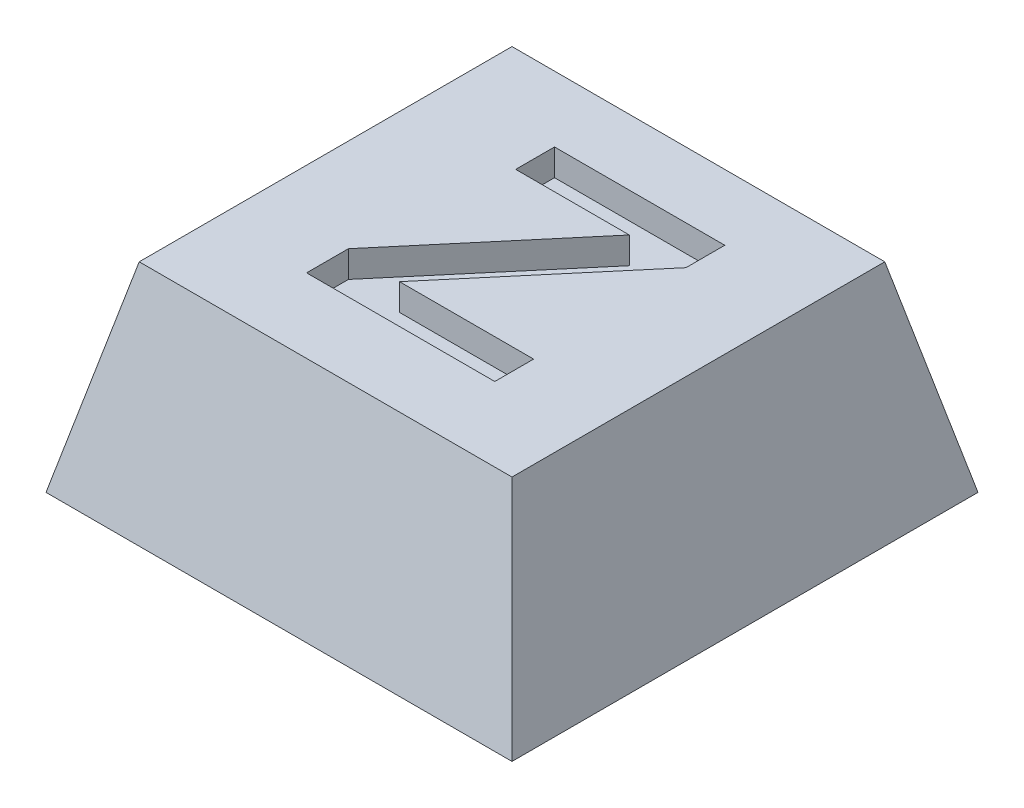
ISO-10303-21;
HEADER;
FILE_DESCRIPTION(('STEP AP214'),'2;1');
FILE_NAME('part.step','',(''),(''),'','','');
FILE_SCHEMA(('AUTOMOTIVE_DESIGN { 1 0 10303 214 1 1 1 1 }'));
ENDSEC;
DATA;
#1=APPLICATION_CONTEXT('core data for automotive mechanical design processes');
#2=APPLICATION_PROTOCOL_DEFINITION('international standard','automotive_design',2000,#1);
#3=PRODUCT_CONTEXT('',#1,'mechanical');
#4=PRODUCT('Part','Part','',(#3));
#5=PRODUCT_RELATED_PRODUCT_CATEGORY('part','',(#4));
#6=PRODUCT_DEFINITION_FORMATION('','',#4);
#7=PRODUCT_DEFINITION_CONTEXT('part definition',#1,'design');
#8=PRODUCT_DEFINITION('design','',#6,#7);
#9=PRODUCT_DEFINITION_SHAPE('','',#8);
#10=(LENGTH_UNIT() NAMED_UNIT(*) SI_UNIT(.MILLI.,.METRE.));
#11=(NAMED_UNIT(*) PLANE_ANGLE_UNIT() SI_UNIT($,.RADIAN.));
#12=(NAMED_UNIT(*) SI_UNIT($,.STERADIAN.) SOLID_ANGLE_UNIT());
#13=UNCERTAINTY_MEASURE_WITH_UNIT(LENGTH_MEASURE(1.E-05),#10,'distance_accuracy_value','');
#14=(GEOMETRIC_REPRESENTATION_CONTEXT(3) GLOBAL_UNCERTAINTY_ASSIGNED_CONTEXT((#13)) GLOBAL_UNIT_ASSIGNED_CONTEXT((#10,
#11,#12)) REPRESENTATION_CONTEXT('',''));
#15=CARTESIAN_POINT('',(0.,0.,0.));
#16=DIRECTION('',(0.,0.,1.));
#17=DIRECTION('',(1.,0.,0.));
#18=AXIS2_PLACEMENT_3D('',#15,#16,#17);
#19=CARTESIAN_POINT('',(0.,3.,0.));
#20=DIRECTION('',(0.,-1.,0.));
#21=DIRECTION('',(0.,0.,-1.));
#22=AXIS2_PLACEMENT_3D('',#19,#20,#21);
#23=PLANE('',#22);
#24=DIRECTION('',(-1.,0.,0.));
#25=VECTOR('',#24,1.);
#26=CARTESIAN_POINT('',(11.,3.,-0.7));
#27=LINE('',#26,#25);
#28=CARTESIAN_POINT('',(6.3,3.,-0.7));
#29=VERTEX_POINT('',#28);
#30=CARTESIAN_POINT('',(0.7,3.,-0.7));
#31=VERTEX_POINT('',#30);
#32=EDGE_CURVE('E65',#29,#31,#27,.T.);
#33=ORIENTED_EDGE('',*,*,#32,.F.);
#34=DIRECTION('',(0.,0.,1.));
#35=VECTOR('',#34,1.);
#36=CARTESIAN_POINT('',(6.3,3.,-7.));
#37=LINE('',#36,#35);
#38=CARTESIAN_POINT('',(6.3,3.,-6.3));
#39=VERTEX_POINT('',#38);
#40=EDGE_CURVE('E194',#39,#29,#37,.T.);
#41=ORIENTED_EDGE('',*,*,#40,.F.);
#42=DIRECTION('',(-1.,0.,0.));
#43=VECTOR('',#42,1.);
#44=CARTESIAN_POINT('',(11.,3.,-6.3));
#45=LINE('',#44,#43);
#46=CARTESIAN_POINT('',(0.699999999999998,3.,-6.3));
#47=VERTEX_POINT('',#46);
#48=EDGE_CURVE('E181',#39,#47,#45,.T.);
#49=ORIENTED_EDGE('',*,*,#48,.T.);
#50=DIRECTION('',(0.,0.,1.));
#51=VECTOR('',#50,1.);
#52=CARTESIAN_POINT('',(0.7,3.,-7.));
#53=LINE('',#52,#51);
#54=EDGE_CURVE('E195',#47,#31,#53,.T.);
#55=ORIENTED_EDGE('',*,*,#54,.T.);
#56=EDGE_LOOP('',(#33,#41,#49,#55));
#57=FACE_BOUND('',#56,.T.);
#58=DIRECTION('',(-1.,0.,0.));
#59=VECTOR('',#58,1.);
#60=CARTESIAN_POINT('',(4.92794379905714,3.,-1.81325809259612));
#61=LINE('',#60,#59);
#62=CARTESIAN_POINT('',(4.92794379905714,3.,-1.81325809259612));
#63=VERTEX_POINT('',#62);
#64=CARTESIAN_POINT('',(2.10102072213406,3.,-1.81325809259612));
#65=VERTEX_POINT('',#64);
#66=EDGE_CURVE('E58',#63,#65,#61,.T.);
#67=ORIENTED_EDGE('',*,*,#66,.T.);
#68=DIRECTION('',(0.,0.,-1.));
#69=VECTOR('',#68,1.);
#70=CARTESIAN_POINT('',(2.10102072213406,3.,-1.81325809259612));
#71=LINE('',#70,#69);
#72=CARTESIAN_POINT('',(2.10102072213406,3.,-2.44146322080125));
#73=VERTEX_POINT('',#72);
#74=EDGE_CURVE('E165',#65,#73,#71,.T.);
#75=ORIENTED_EDGE('',*,*,#74,.T.);
#76=DIRECTION('',(0.644870939209783,0.,-0.764291483507891));
#77=VECTOR('',#76,1.);
#78=CARTESIAN_POINT('',(2.10102072213406,3.,-2.44146322080125));
#79=LINE('',#78,#77);
#80=CARTESIAN_POINT('',(4.03191014521099,3.,-4.72992475926278));
#81=VERTEX_POINT('',#80);
#82=EDGE_CURVE('E490',#73,#81,#79,.T.);
#83=ORIENTED_EDGE('',*,*,#82,.T.);
#84=DIRECTION('',(-1.,0.,0.));
#85=VECTOR('',#84,1.);
#86=CARTESIAN_POINT('',(4.03191014521099,3.,-4.72992475926278));
#87=LINE('',#86,#85);
#88=CARTESIAN_POINT('',(2.32537969649304,3.,-4.72992475926278));
#89=VERTEX_POINT('',#88);
#90=EDGE_CURVE('E492',#81,#89,#87,.T.);
#91=ORIENTED_EDGE('',*,*,#90,.T.);
#92=DIRECTION('',(0.,0.,-1.));
#93=VECTOR('',#92,1.);
#94=CARTESIAN_POINT('',(2.32537969649304,3.,-4.72992475926278));
#95=LINE('',#94,#93);
#96=CARTESIAN_POINT('',(2.32537969649304,3.,-5.31325809259612));
#97=VERTEX_POINT('',#96);
#98=EDGE_CURVE('E497',#89,#97,#95,.T.);
#99=ORIENTED_EDGE('',*,*,#98,.T.);
#100=DIRECTION('',(1.,0.,0.));
#101=VECTOR('',#100,1.);
#102=CARTESIAN_POINT('',(2.32537969649304,3.,-5.31325809259612));
#103=LINE('',#102,#101);
#104=CARTESIAN_POINT('',(4.88307200418534,3.,-5.31325809259612));
#105=VERTEX_POINT('',#104);
#106=EDGE_CURVE('E507',#97,#105,#103,.T.);
#107=ORIENTED_EDGE('',*,*,#106,.T.);
#108=DIRECTION('',(0.,0.,1.));
#109=VECTOR('',#108,1.);
#110=CARTESIAN_POINT('',(4.88307200418534,3.,-5.31325809259612));
#111=LINE('',#110,#109);
#112=CARTESIAN_POINT('',(4.88307200418534,3.,-4.72992475926278));
#113=VERTEX_POINT('',#112);
#114=EDGE_CURVE('E462',#105,#113,#111,.T.);
#115=ORIENTED_EDGE('',*,*,#114,.T.);
#116=DIRECTION('',(-0.645005060359543,0.,0.76417829863886));
#117=VECTOR('',#116,1.);
#118=CARTESIAN_POINT('',(4.88307200418534,3.,-4.72992475926278));
#119=LINE('',#118,#117);
#120=CARTESIAN_POINT('',(2.91362088239047,3.,-2.39659142592945));
#121=VERTEX_POINT('',#120);
#122=EDGE_CURVE('E457',#113,#121,#119,.T.);
#123=ORIENTED_EDGE('',*,*,#122,.T.);
#124=DIRECTION('',(1.,0.,0.));
#125=VECTOR('',#124,1.);
#126=CARTESIAN_POINT('',(2.91362088239047,3.,-2.39659142592945));
#127=LINE('',#126,#125);
#128=CARTESIAN_POINT('',(4.92794379905714,3.,-2.39659142592945));
#129=VERTEX_POINT('',#128);
#130=EDGE_CURVE('E451',#121,#129,#127,.T.);
#131=ORIENTED_EDGE('',*,*,#130,.T.);
#132=DIRECTION('',(0.,0.,1.));
#133=VECTOR('',#132,1.);
#134=CARTESIAN_POINT('',(4.92794379905714,3.,-2.39659142592945));
#135=LINE('',#134,#133);
#136=EDGE_CURVE('E161',#129,#63,#135,.T.);
#137=ORIENTED_EDGE('',*,*,#136,.T.);
#138=EDGE_LOOP('',(#67,#75,#83,#91,#99,#107,#115,#123,#131,#137));
#139=FACE_BOUND('',#138,.T.);
#140=ADVANCED_FACE('F42',(#57,#139),#23,.F.);
#141=CARTESIAN_POINT('',(7.,0.,-7.));
#142=DIRECTION('',(-0.973841209741793,-0.227229615606418,0.));
#143=DIRECTION('',(0.227229615606418,-0.973841209741793,0.));
#144=AXIS2_PLACEMENT_3D('',#141,#142,#143);
#145=PLANE('',#144);
#146=DIRECTION('',(-0.221581128241521,0.949633406749377,-0.221581128241521));
#147=VECTOR('',#146,1.);
#148=CARTESIAN_POINT('',(6.6563126252505,1.47294589178357,-0.343687374749499));
#149=LINE('',#148,#147);
#150=CARTESIAN_POINT('',(7.,0.,0.));
#151=VERTEX_POINT('',#150);
#152=EDGE_CURVE('E191',#151,#29,#149,.T.);
#153=ORIENTED_EDGE('',*,*,#152,.F.);
#154=DIRECTION('',(0.,0.,-1.));
#155=VECTOR('',#154,1.);
#156=CARTESIAN_POINT('',(7.,0.,0.));
#157=LINE('',#156,#155);
#158=CARTESIAN_POINT('',(7.,0.,-7.));
#159=VERTEX_POINT('',#158);
#160=EDGE_CURVE('E209',#151,#159,#157,.T.);
#161=ORIENTED_EDGE('',*,*,#160,.T.);
#162=DIRECTION('',(0.221581128241521,-0.949633406749377,-0.221581128241521));
#163=VECTOR('',#162,1.);
#164=CARTESIAN_POINT('',(7.,0.,-7.));
#165=LINE('',#164,#163);
#166=EDGE_CURVE('E185',#39,#159,#165,.T.);
#167=ORIENTED_EDGE('',*,*,#166,.F.);
#168=ORIENTED_EDGE('',*,*,#40,.T.);
#169=EDGE_LOOP('',(#153,#161,#167,#168));
#170=FACE_BOUND('',#169,.T.);
#171=ADVANCED_FACE('F234',(#170),#145,.F.);
#172=CARTESIAN_POINT('',(0.,0.,-7.));
#173=DIRECTION('',(0.973841209741793,-0.227229615606418,0.));
#174=DIRECTION('',(0.227229615606418,0.973841209741793,0.));
#175=AXIS2_PLACEMENT_3D('',#172,#173,#174);
#176=PLANE('',#175);
#177=DIRECTION('',(-0.221581128241521,-0.949633406749378,0.221581128241521));
#178=VECTOR('',#177,1.);
#179=CARTESIAN_POINT('',(0.343687374749499,1.47294589178357,-0.3436873747495));
#180=LINE('',#179,#178);
#181=CARTESIAN_POINT('',(0.,0.,0.));
#182=VERTEX_POINT('',#181);
#183=EDGE_CURVE('E11',#31,#182,#180,.T.);
#184=ORIENTED_EDGE('',*,*,#183,.F.);
#185=ORIENTED_EDGE('',*,*,#54,.F.);
#186=DIRECTION('',(0.221581128241521,0.949633406749377,0.221581128241521));
#187=VECTOR('',#186,1.);
#188=CARTESIAN_POINT('',(0.,0.,-7.));
#189=LINE('',#188,#187);
#190=CARTESIAN_POINT('',(0.,0.,-7.));
#191=VERTEX_POINT('',#190);
#192=EDGE_CURVE('E51',#191,#47,#189,.T.);
#193=ORIENTED_EDGE('',*,*,#192,.F.);
#194=DIRECTION('',(0.,0.,1.));
#195=VECTOR('',#194,1.);
#196=CARTESIAN_POINT('',(0.,0.,0.));
#197=LINE('',#196,#195);
#198=EDGE_CURVE('E199',#191,#182,#197,.T.);
#199=ORIENTED_EDGE('',*,*,#198,.T.);
#200=EDGE_LOOP('',(#184,#185,#193,#199));
#201=FACE_BOUND('',#200,.T.);
#202=ADVANCED_FACE('F227',(#201),#176,.F.);
#203=CARTESIAN_POINT('',(0.,0.,0.));
#204=DIRECTION('',(0.,-1.,0.));
#205=DIRECTION('',(0.,0.,-1.));
#206=AXIS2_PLACEMENT_3D('',#203,#204,#205);
#207=PLANE('',#206);
#208=CARTESIAN_POINT('',(3.5,0.,-3.5));
#209=DIRECTION('',(0.,-1.,0.));
#210=DIRECTION('',(0.,0.,-1.));
#211=AXIS2_PLACEMENT_3D('',#208,#209,#210);
#212=CIRCLE('',#211,1.8);
#213=CARTESIAN_POINT('',(3.5,0.,-5.3));
#214=VERTEX_POINT('',#213);
#215=EDGE_CURVE('E167',#214,#214,#212,.T.);
#216=ORIENTED_EDGE('',*,*,#215,.F.);
#217=EDGE_LOOP('',(#216));
#218=FACE_BOUND('',#217,.T.);
#219=ORIENTED_EDGE('',*,*,#198,.F.);
#220=DIRECTION('',(-1.,0.,0.));
#221=VECTOR('',#220,1.);
#222=CARTESIAN_POINT('',(0.,0.,-7.));
#223=LINE('',#222,#221);
#224=EDGE_CURVE('E213',#159,#191,#223,.T.);
#225=ORIENTED_EDGE('',*,*,#224,.F.);
#226=ORIENTED_EDGE('',*,*,#160,.F.);
#227=DIRECTION('',(1.,0.,0.));
#228=VECTOR('',#227,1.);
#229=CARTESIAN_POINT('',(0.,0.,0.));
#230=LINE('',#229,#228);
#231=EDGE_CURVE('E206',#182,#151,#230,.T.);
#232=ORIENTED_EDGE('',*,*,#231,.F.);
#233=EDGE_LOOP('',(#219,#225,#226,#232));
#234=FACE_BOUND('',#233,.T.);
#235=ADVANCED_FACE('F44',(#218,#234),#207,.T.);
#236=CARTESIAN_POINT('',(11.,3.,-6.3));
#237=DIRECTION('',(0.,0.227229615606418,-0.973841209741793));
#238=DIRECTION('',(0.,0.973841209741793,0.227229615606418));
#239=AXIS2_PLACEMENT_3D('',#236,#237,#238);
#240=PLANE('',#239);
#241=ORIENTED_EDGE('',*,*,#166,.T.);
#242=ORIENTED_EDGE('',*,*,#224,.T.);
#243=ORIENTED_EDGE('',*,*,#192,.T.);
#244=ORIENTED_EDGE('',*,*,#48,.F.);
#245=EDGE_LOOP('',(#241,#242,#243,#244));
#246=FACE_BOUND('',#245,.T.);
#247=ADVANCED_FACE('F218',(#246),#240,.T.);
#248=CARTESIAN_POINT('',(11.,0.,0.));
#249=DIRECTION('',(0.,0.227229615606418,0.973841209741793));
#250=DIRECTION('',(0.,-0.973841209741793,0.227229615606418));
#251=AXIS2_PLACEMENT_3D('',#248,#249,#250);
#252=PLANE('',#251);
#253=ORIENTED_EDGE('',*,*,#152,.T.);
#254=ORIENTED_EDGE('',*,*,#32,.T.);
#255=ORIENTED_EDGE('',*,*,#183,.T.);
#256=ORIENTED_EDGE('',*,*,#231,.T.);
#257=EDGE_LOOP('',(#253,#254,#255,#256));
#258=FACE_BOUND('',#257,.T.);
#259=ADVANCED_FACE('F229',(#258),#252,.T.);
#260=CARTESIAN_POINT('',(3.5,0.8,-3.5));
#261=DIRECTION('',(0.,-1.,0.));
#262=DIRECTION('',(0.,0.,-1.));
#263=AXIS2_PLACEMENT_3D('',#260,#261,#262);
#264=CYLINDRICAL_SURFACE('',#263,1.8);
#265=CARTESIAN_POINT('',(3.5,0.8,-3.5));
#266=DIRECTION('',(0.,-1.,0.));
#267=DIRECTION('',(0.,0.,-1.));
#268=AXIS2_PLACEMENT_3D('',#265,#266,#267);
#269=CIRCLE('',#268,1.8);
#270=CARTESIAN_POINT('',(3.5,0.8,-5.3));
#271=VERTEX_POINT('',#270);
#272=EDGE_CURVE('E173',#271,#271,#269,.T.);
#273=ORIENTED_EDGE('',*,*,#272,.F.);
#274=EDGE_LOOP('',(#273));
#275=FACE_BOUND('',#274,.T.);
#276=ORIENTED_EDGE('',*,*,#215,.T.);
#277=EDGE_LOOP('',(#276));
#278=FACE_BOUND('',#277,.T.);
#279=ADVANCED_FACE('F254',(#275,#278),#264,.F.);
#280=CARTESIAN_POINT('',(3.5,0.8,-3.5));
#281=DIRECTION('',(0.,-1.,0.));
#282=DIRECTION('',(0.,0.,-1.));
#283=AXIS2_PLACEMENT_3D('',#280,#281,#282);
#284=PLANE('',#283);
#285=ORIENTED_EDGE('',*,*,#272,.T.);
#286=EDGE_LOOP('',(#285));
#287=FACE_BOUND('',#286,.T.);
#288=ADVANCED_FACE('F257',(#287),#284,.T.);
#289=CARTESIAN_POINT('',(4.92794379905714,2.6,-1.81325809259612));
#290=DIRECTION('',(0.,0.,-1.));
#291=DIRECTION('',(-1.,0.,0.));
#292=AXIS2_PLACEMENT_3D('',#289,#290,#291);
#293=PLANE('',#292);
#294=ORIENTED_EDGE('',*,*,#66,.F.);
#295=DIRECTION('',(0.,1.,0.));
#296=VECTOR('',#295,1.);
#297=CARTESIAN_POINT('',(4.92794379905714,2.6,-1.81325809259612));
#298=LINE('',#297,#296);
#299=CARTESIAN_POINT('',(4.92794379905714,2.6,-1.81325809259612));
#300=VERTEX_POINT('',#299);
#301=EDGE_CURVE('E159',#300,#63,#298,.T.);
#302=ORIENTED_EDGE('',*,*,#301,.F.);
#303=DIRECTION('',(-1.,0.,0.));
#304=VECTOR('',#303,1.);
#305=CARTESIAN_POINT('',(4.92794379905714,2.6,-1.81325809259612));
#306=LINE('',#305,#304);
#307=CARTESIAN_POINT('',(2.10102072213406,2.6,-1.81325809259612));
#308=VERTEX_POINT('',#307);
#309=EDGE_CURVE('E149',#300,#308,#306,.T.);
#310=ORIENTED_EDGE('',*,*,#309,.T.);
#311=DIRECTION('',(0.,1.,0.));
#312=VECTOR('',#311,1.);
#313=CARTESIAN_POINT('',(2.10102072213406,2.6,-1.81325809259612));
#314=LINE('',#313,#312);
#315=EDGE_CURVE('E158',#308,#65,#314,.T.);
#316=ORIENTED_EDGE('',*,*,#315,.T.);
#317=EDGE_LOOP('',(#294,#302,#310,#316));
#318=FACE_BOUND('',#317,.T.);
#319=ADVANCED_FACE('F157',(#318),#293,.T.);
#320=CARTESIAN_POINT('',(2.10102072213406,2.6,-1.81325809259612));
#321=DIRECTION('',(1.,0.,0.));
#322=DIRECTION('',(0.,0.,-1.));
#323=AXIS2_PLACEMENT_3D('',#320,#321,#322);
#324=PLANE('',#323);
#325=ORIENTED_EDGE('',*,*,#74,.F.);
#326=ORIENTED_EDGE('',*,*,#315,.F.);
#327=DIRECTION('',(0.,0.,-1.));
#328=VECTOR('',#327,1.);
#329=CARTESIAN_POINT('',(2.10102072213406,2.6,-1.81325809259612));
#330=LINE('',#329,#328);
#331=CARTESIAN_POINT('',(2.10102072213406,2.6,-2.44146322080125));
#332=VERTEX_POINT('',#331);
#333=EDGE_CURVE('E145',#308,#332,#330,.T.);
#334=ORIENTED_EDGE('',*,*,#333,.T.);
#335=DIRECTION('',(0.,1.,0.));
#336=VECTOR('',#335,1.);
#337=CARTESIAN_POINT('',(2.10102072213406,2.6,-2.44146322080125));
#338=LINE('',#337,#336);
#339=EDGE_CURVE('E168',#332,#73,#338,.T.);
#340=ORIENTED_EDGE('',*,*,#339,.T.);
#341=EDGE_LOOP('',(#325,#326,#334,#340));
#342=FACE_BOUND('',#341,.T.);
#343=ADVANCED_FACE('F163',(#342),#324,.T.);
#344=CARTESIAN_POINT('',(2.10102072213406,2.6,-2.44146322080125));
#345=DIRECTION('',(0.764291483507891,0.,0.644870939209783));
#346=DIRECTION('',(0.644870939209783,0.,-0.764291483507891));
#347=AXIS2_PLACEMENT_3D('',#344,#345,#346);
#348=PLANE('',#347);
#349=ORIENTED_EDGE('',*,*,#82,.F.);
#350=ORIENTED_EDGE('',*,*,#339,.F.);
#351=DIRECTION('',(0.644870939209783,0.,-0.764291483507891));
#352=VECTOR('',#351,1.);
#353=CARTESIAN_POINT('',(2.10102072213406,2.6,-2.44146322080125));
#354=LINE('',#353,#352);
#355=CARTESIAN_POINT('',(4.03191014521099,2.6,-4.72992475926278));
#356=VERTEX_POINT('',#355);
#357=EDGE_CURVE('E151',#332,#356,#354,.T.);
#358=ORIENTED_EDGE('',*,*,#357,.T.);
#359=DIRECTION('',(0.,1.,0.));
#360=VECTOR('',#359,1.);
#361=CARTESIAN_POINT('',(4.03191014521099,2.6,-4.72992475926278));
#362=LINE('',#361,#360);
#363=EDGE_CURVE('E175',#356,#81,#362,.T.);
#364=ORIENTED_EDGE('',*,*,#363,.T.);
#365=EDGE_LOOP('',(#349,#350,#358,#364));
#366=FACE_BOUND('',#365,.T.);
#367=ADVANCED_FACE('F266',(#366),#348,.T.);
#368=CARTESIAN_POINT('',(4.03191014521099,2.6,-4.72992475926278));
#369=DIRECTION('',(0.,0.,-1.));
#370=DIRECTION('',(-1.,0.,0.));
#371=AXIS2_PLACEMENT_3D('',#368,#369,#370);
#372=PLANE('',#371);
#373=ORIENTED_EDGE('',*,*,#90,.F.);
#374=ORIENTED_EDGE('',*,*,#363,.F.);
#375=DIRECTION('',(-1.,0.,0.));
#376=VECTOR('',#375,1.);
#377=CARTESIAN_POINT('',(4.03191014521099,2.6,-4.72992475926278));
#378=LINE('',#377,#376);
#379=CARTESIAN_POINT('',(2.32537969649304,2.6,-4.72992475926278));
#380=VERTEX_POINT('',#379);
#381=EDGE_CURVE('E537',#356,#380,#378,.T.);
#382=ORIENTED_EDGE('',*,*,#381,.T.);
#383=DIRECTION('',(0.,1.,0.));
#384=VECTOR('',#383,1.);
#385=CARTESIAN_POINT('',(2.32537969649304,2.6,-4.72992475926278));
#386=LINE('',#385,#384);
#387=EDGE_CURVE('E483',#380,#89,#386,.T.);
#388=ORIENTED_EDGE('',*,*,#387,.T.);
#389=EDGE_LOOP('',(#373,#374,#382,#388));
#390=FACE_BOUND('',#389,.T.);
#391=ADVANCED_FACE('F269',(#390),#372,.T.);
#392=CARTESIAN_POINT('',(2.32537969649304,2.6,-4.72992475926278));
#393=DIRECTION('',(1.,0.,0.));
#394=DIRECTION('',(0.,0.,-1.));
#395=AXIS2_PLACEMENT_3D('',#392,#393,#394);
#396=PLANE('',#395);
#397=ORIENTED_EDGE('',*,*,#98,.F.);
#398=ORIENTED_EDGE('',*,*,#387,.F.);
#399=DIRECTION('',(0.,0.,-1.));
#400=VECTOR('',#399,1.);
#401=CARTESIAN_POINT('',(2.32537969649304,2.6,-4.72992475926278));
#402=LINE('',#401,#400);
#403=CARTESIAN_POINT('',(2.32537969649304,2.6,-5.31325809259612));
#404=VERTEX_POINT('',#403);
#405=EDGE_CURVE('E534',#380,#404,#402,.T.);
#406=ORIENTED_EDGE('',*,*,#405,.T.);
#407=DIRECTION('',(0.,1.,0.));
#408=VECTOR('',#407,1.);
#409=CARTESIAN_POINT('',(2.32537969649304,2.6,-5.31325809259612));
#410=LINE('',#409,#408);
#411=EDGE_CURVE('E480',#404,#97,#410,.T.);
#412=ORIENTED_EDGE('',*,*,#411,.T.);
#413=EDGE_LOOP('',(#397,#398,#406,#412));
#414=FACE_BOUND('',#413,.T.);
#415=ADVANCED_FACE('F273',(#414),#396,.T.);
#416=CARTESIAN_POINT('',(2.32537969649304,2.6,-5.31325809259612));
#417=DIRECTION('',(0.,0.,1.));
#418=DIRECTION('',(1.,0.,0.));
#419=AXIS2_PLACEMENT_3D('',#416,#417,#418);
#420=PLANE('',#419);
#421=ORIENTED_EDGE('',*,*,#106,.F.);
#422=ORIENTED_EDGE('',*,*,#411,.F.);
#423=DIRECTION('',(1.,0.,0.));
#424=VECTOR('',#423,1.);
#425=CARTESIAN_POINT('',(2.32537969649304,2.6,-5.31325809259612));
#426=LINE('',#425,#424);
#427=CARTESIAN_POINT('',(4.88307200418534,2.6,-5.31325809259612));
#428=VERTEX_POINT('',#427);
#429=EDGE_CURVE('E531',#404,#428,#426,.T.);
#430=ORIENTED_EDGE('',*,*,#429,.T.);
#431=DIRECTION('',(0.,1.,0.));
#432=VECTOR('',#431,1.);
#433=CARTESIAN_POINT('',(4.88307200418534,2.6,-5.31325809259612));
#434=LINE('',#433,#432);
#435=EDGE_CURVE('E477',#428,#105,#434,.T.);
#436=ORIENTED_EDGE('',*,*,#435,.T.);
#437=EDGE_LOOP('',(#421,#422,#430,#436));
#438=FACE_BOUND('',#437,.T.);
#439=ADVANCED_FACE('F277',(#438),#420,.T.);
#440=CARTESIAN_POINT('',(4.88307200418534,2.6,-5.31325809259612));
#441=DIRECTION('',(-1.,0.,0.));
#442=DIRECTION('',(0.,0.,1.));
#443=AXIS2_PLACEMENT_3D('',#440,#441,#442);
#444=PLANE('',#443);
#445=ORIENTED_EDGE('',*,*,#114,.F.);
#446=ORIENTED_EDGE('',*,*,#435,.F.);
#447=DIRECTION('',(0.,0.,1.));
#448=VECTOR('',#447,1.);
#449=CARTESIAN_POINT('',(4.88307200418534,2.6,-5.31325809259612));
#450=LINE('',#449,#448);
#451=CARTESIAN_POINT('',(4.88307200418534,2.6,-4.72992475926278));
#452=VERTEX_POINT('',#451);
#453=EDGE_CURVE('E516',#428,#452,#450,.T.);
#454=ORIENTED_EDGE('',*,*,#453,.T.);
#455=DIRECTION('',(0.,1.,0.));
#456=VECTOR('',#455,1.);
#457=CARTESIAN_POINT('',(4.88307200418534,2.6,-4.72992475926278));
#458=LINE('',#457,#456);
#459=EDGE_CURVE('E474',#452,#113,#458,.T.);
#460=ORIENTED_EDGE('',*,*,#459,.T.);
#461=EDGE_LOOP('',(#445,#446,#454,#460));
#462=FACE_BOUND('',#461,.T.);
#463=ADVANCED_FACE('F281',(#462),#444,.T.);
#464=CARTESIAN_POINT('',(4.88307200418534,2.6,-4.72992475926278));
#465=DIRECTION('',(-0.76417829863886,0.,-0.645005060359543));
#466=DIRECTION('',(-0.645005060359543,0.,0.76417829863886));
#467=AXIS2_PLACEMENT_3D('',#464,#465,#466);
#468=PLANE('',#467);
#469=ORIENTED_EDGE('',*,*,#122,.F.);
#470=ORIENTED_EDGE('',*,*,#459,.F.);
#471=DIRECTION('',(-0.645005060359543,0.,0.76417829863886));
#472=VECTOR('',#471,1.);
#473=CARTESIAN_POINT('',(4.88307200418534,2.6,-4.72992475926278));
#474=LINE('',#473,#472);
#475=CARTESIAN_POINT('',(2.91362088239047,2.6,-2.39659142592945));
#476=VERTEX_POINT('',#475);
#477=EDGE_CURVE('E518',#452,#476,#474,.T.);
#478=ORIENTED_EDGE('',*,*,#477,.T.);
#479=DIRECTION('',(0.,1.,0.));
#480=VECTOR('',#479,1.);
#481=CARTESIAN_POINT('',(2.91362088239047,2.6,-2.39659142592945));
#482=LINE('',#481,#480);
#483=EDGE_CURVE('E471',#476,#121,#482,.T.);
#484=ORIENTED_EDGE('',*,*,#483,.T.);
#485=EDGE_LOOP('',(#469,#470,#478,#484));
#486=FACE_BOUND('',#485,.T.);
#487=ADVANCED_FACE('F285',(#486),#468,.T.);
#488=CARTESIAN_POINT('',(2.91362088239047,2.6,-2.39659142592945));
#489=DIRECTION('',(0.,0.,1.));
#490=DIRECTION('',(1.,0.,0.));
#491=AXIS2_PLACEMENT_3D('',#488,#489,#490);
#492=PLANE('',#491);
#493=ORIENTED_EDGE('',*,*,#130,.F.);
#494=ORIENTED_EDGE('',*,*,#483,.F.);
#495=DIRECTION('',(1.,0.,0.));
#496=VECTOR('',#495,1.);
#497=CARTESIAN_POINT('',(2.91362088239047,2.6,-2.39659142592945));
#498=LINE('',#497,#496);
#499=CARTESIAN_POINT('',(4.92794379905714,2.6,-2.39659142592945));
#500=VERTEX_POINT('',#499);
#501=EDGE_CURVE('E520',#476,#500,#498,.T.);
#502=ORIENTED_EDGE('',*,*,#501,.T.);
#503=DIRECTION('',(0.,1.,0.));
#504=VECTOR('',#503,1.);
#505=CARTESIAN_POINT('',(4.92794379905714,2.6,-2.39659142592945));
#506=LINE('',#505,#504);
#507=EDGE_CURVE('E449',#500,#129,#506,.T.);
#508=ORIENTED_EDGE('',*,*,#507,.T.);
#509=EDGE_LOOP('',(#493,#494,#502,#508));
#510=FACE_BOUND('',#509,.T.);
#511=ADVANCED_FACE('F289',(#510),#492,.T.);
#512=CARTESIAN_POINT('',(4.92794379905714,2.6,-2.39659142592945));
#513=DIRECTION('',(-1.,0.,0.));
#514=DIRECTION('',(0.,0.,1.));
#515=AXIS2_PLACEMENT_3D('',#512,#513,#514);
#516=PLANE('',#515);
#517=ORIENTED_EDGE('',*,*,#136,.F.);
#518=ORIENTED_EDGE('',*,*,#507,.F.);
#519=DIRECTION('',(0.,0.,1.));
#520=VECTOR('',#519,1.);
#521=CARTESIAN_POINT('',(4.92794379905714,2.6,-2.39659142592945));
#522=LINE('',#521,#520);
#523=EDGE_CURVE('E468',#500,#300,#522,.T.);
#524=ORIENTED_EDGE('',*,*,#523,.T.);
#525=ORIENTED_EDGE('',*,*,#301,.T.);
#526=EDGE_LOOP('',(#517,#518,#524,#525));
#527=FACE_BOUND('',#526,.T.);
#528=ADVANCED_FACE('F293',(#527),#516,.T.);
#529=CARTESIAN_POINT('',(0.,2.6,0.));
#530=DIRECTION('',(0.,-1.,0.));
#531=DIRECTION('',(0.,0.,-1.));
#532=AXIS2_PLACEMENT_3D('',#529,#530,#531);
#533=PLANE('',#532);
#534=ORIENTED_EDGE('',*,*,#309,.F.);
#535=ORIENTED_EDGE('',*,*,#523,.F.);
#536=ORIENTED_EDGE('',*,*,#501,.F.);
#537=ORIENTED_EDGE('',*,*,#477,.F.);
#538=ORIENTED_EDGE('',*,*,#453,.F.);
#539=ORIENTED_EDGE('',*,*,#429,.F.);
#540=ORIENTED_EDGE('',*,*,#405,.F.);
#541=ORIENTED_EDGE('',*,*,#381,.F.);
#542=ORIENTED_EDGE('',*,*,#357,.F.);
#543=ORIENTED_EDGE('',*,*,#333,.F.);
#544=EDGE_LOOP('',(#534,#535,#536,#537,#538,#539,#540,#541,#542,#543));
#545=FACE_BOUND('',#544,.T.);
#546=ADVANCED_FACE('F147',(#545),#533,.F.);
#547=CLOSED_SHELL('',(#140,#171,#202,#235,#247,#259,#279,#288,#319,#343,#367,#391,#415,#439,
#463,#487,#511,#528,#546));
#548=MANIFOLD_SOLID_BREP('B2',#547);
#549=ADVANCED_BREP_SHAPE_REPRESENTATION('',(#18,#548),#14);
#550=SHAPE_DEFINITION_REPRESENTATION(#9,#549);
ENDSEC;
END-ISO-10303-21;
